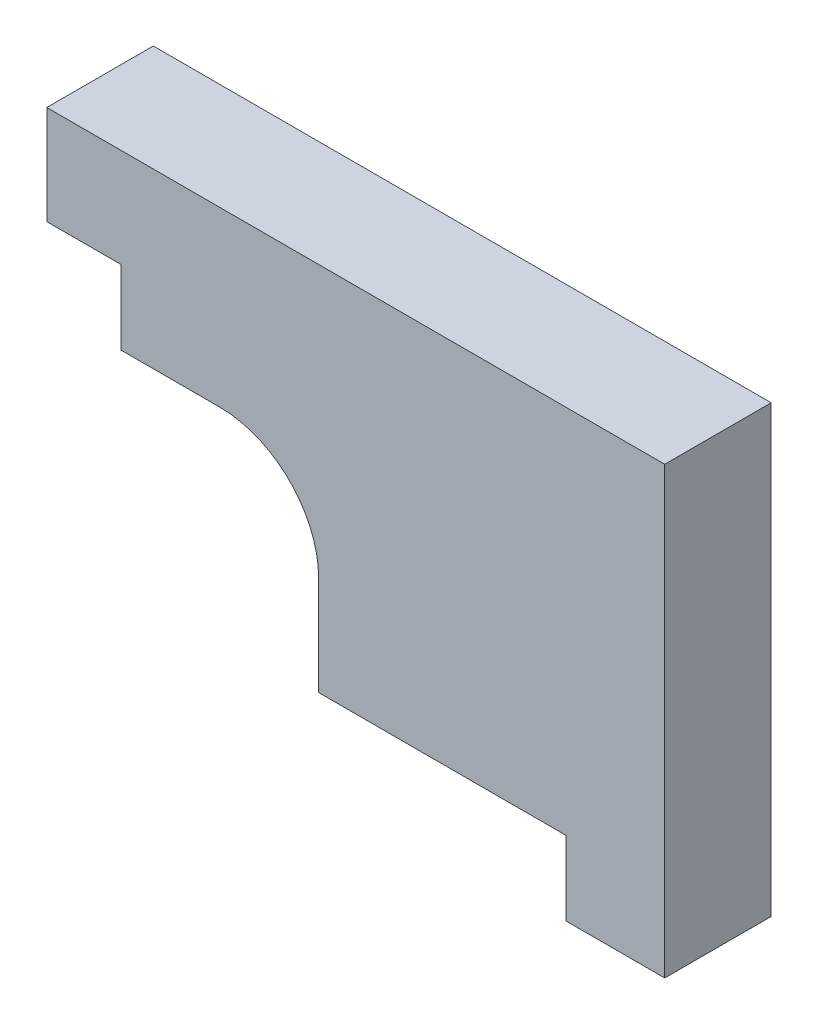
ISO-10303-21;
HEADER;
FILE_DESCRIPTION(('STEP AP214'),'2;1');
FILE_NAME('part.step','',(''),(''),'','','');
FILE_SCHEMA(('AUTOMOTIVE_DESIGN { 1 0 10303 214 1 1 1 1 }'));
ENDSEC;
DATA;
#1=APPLICATION_CONTEXT('core data for automotive mechanical design processes');
#2=APPLICATION_PROTOCOL_DEFINITION('international standard','automotive_design',2000,#1);
#3=PRODUCT_CONTEXT('',#1,'mechanical');
#4=PRODUCT('Part','Part','',(#3));
#5=PRODUCT_RELATED_PRODUCT_CATEGORY('part','',(#4));
#6=PRODUCT_DEFINITION_FORMATION('','',#4);
#7=PRODUCT_DEFINITION_CONTEXT('part definition',#1,'design');
#8=PRODUCT_DEFINITION('design','',#6,#7);
#9=PRODUCT_DEFINITION_SHAPE('','',#8);
#10=(LENGTH_UNIT() NAMED_UNIT(*) SI_UNIT(.MILLI.,.METRE.));
#11=(NAMED_UNIT(*) PLANE_ANGLE_UNIT() SI_UNIT($,.RADIAN.));
#12=(NAMED_UNIT(*) SI_UNIT($,.STERADIAN.) SOLID_ANGLE_UNIT());
#13=UNCERTAINTY_MEASURE_WITH_UNIT(LENGTH_MEASURE(1.E-05),#10,'distance_accuracy_value','');
#14=(GEOMETRIC_REPRESENTATION_CONTEXT(3) GLOBAL_UNCERTAINTY_ASSIGNED_CONTEXT((#13)) GLOBAL_UNIT_ASSIGNED_CONTEXT((#10,
#11,#12)) REPRESENTATION_CONTEXT('',''));
#15=CARTESIAN_POINT('',(0.,0.,0.));
#16=DIRECTION('',(0.,0.,1.));
#17=DIRECTION('',(1.,0.,0.));
#18=AXIS2_PLACEMENT_3D('',#15,#16,#17);
#19=CARTESIAN_POINT('',(130.,130.,-21.54283537726));
#20=DIRECTION('',(0.,0.,1.));
#21=DIRECTION('',(1.,0.,0.));
#22=AXIS2_PLACEMENT_3D('',#19,#20,#21);
#23=CYLINDRICAL_SURFACE('',#22,20.);
#24=CARTESIAN_POINT('',(130.,130.,0.));
#25=DIRECTION('',(0.,0.,-1.));
#26=DIRECTION('',(1.,0.,0.));
#27=AXIS2_PLACEMENT_3D('',#24,#25,#26);
#28=CIRCLE('',#27,20.);
#29=CARTESIAN_POINT('',(130.,150.,0.));
#30=VERTEX_POINT('',#29);
#31=CARTESIAN_POINT('',(150.,130.,0.));
#32=VERTEX_POINT('',#31);
#33=EDGE_CURVE('E154',#30,#32,#28,.T.);
#34=ORIENTED_EDGE('',*,*,#33,.F.);
#35=DIRECTION('',(0.,0.,1.));
#36=VECTOR('',#35,1.);
#37=CARTESIAN_POINT('',(130.,150.,-21.54283537726));
#38=LINE('',#37,#36);
#39=CARTESIAN_POINT('',(130.,150.,-21.54283537726));
#40=VERTEX_POINT('',#39);
#41=EDGE_CURVE('E11',#40,#30,#38,.T.);
#42=ORIENTED_EDGE('',*,*,#41,.F.);
#43=CARTESIAN_POINT('',(130.,130.,-21.54283537726));
#44=DIRECTION('',(0.,0.,-1.));
#45=DIRECTION('',(1.,0.,0.));
#46=AXIS2_PLACEMENT_3D('',#43,#44,#45);
#47=CIRCLE('',#46,20.);
#48=CARTESIAN_POINT('',(150.,130.,-21.54283537726));
#49=VERTEX_POINT('',#48);
#50=EDGE_CURVE('E183',#40,#49,#47,.T.);
#51=ORIENTED_EDGE('',*,*,#50,.T.);
#52=DIRECTION('',(0.,0.,1.));
#53=VECTOR('',#52,1.);
#54=CARTESIAN_POINT('',(150.,130.,-21.54283537726));
#55=LINE('',#54,#53);
#56=EDGE_CURVE('E42',#49,#32,#55,.T.);
#57=ORIENTED_EDGE('',*,*,#56,.T.);
#58=EDGE_LOOP('',(#34,#42,#51,#57));
#59=FACE_BOUND('',#58,.T.);
#60=ADVANCED_FACE('F39',(#59),#23,.F.);
#61=CARTESIAN_POINT('',(130.,150.,-21.54283537726));
#62=DIRECTION('',(0.,-1.,0.));
#63=DIRECTION('',(0.,0.,-1.));
#64=AXIS2_PLACEMENT_3D('',#61,#62,#63);
#65=PLANE('',#64);
#66=DIRECTION('',(1.,0.,0.));
#67=VECTOR('',#66,1.);
#68=CARTESIAN_POINT('',(130.,150.,0.));
#69=LINE('',#68,#67);
#70=CARTESIAN_POINT('',(110.,150.,0.));
#71=VERTEX_POINT('',#70);
#72=EDGE_CURVE('E181',#71,#30,#69,.T.);
#73=ORIENTED_EDGE('',*,*,#72,.F.);
#74=DIRECTION('',(0.,0.,1.));
#75=VECTOR('',#74,1.);
#76=CARTESIAN_POINT('',(110.,150.,-21.54283537726));
#77=LINE('',#76,#75);
#78=CARTESIAN_POINT('',(110.,150.,-21.54283537726));
#79=VERTEX_POINT('',#78);
#80=EDGE_CURVE('E48',#79,#71,#77,.T.);
#81=ORIENTED_EDGE('',*,*,#80,.F.);
#82=DIRECTION('',(1.,0.,0.));
#83=VECTOR('',#82,1.);
#84=CARTESIAN_POINT('',(130.,150.,-21.54283537726));
#85=LINE('',#84,#83);
#86=EDGE_CURVE('E144',#79,#40,#85,.T.);
#87=ORIENTED_EDGE('',*,*,#86,.T.);
#88=ORIENTED_EDGE('',*,*,#41,.T.);
#89=EDGE_LOOP('',(#73,#81,#87,#88));
#90=FACE_BOUND('',#89,.T.);
#91=ADVANCED_FACE('F201',(#90),#65,.T.);
#92=CARTESIAN_POINT('',(110.,150.,-21.54283537726));
#93=DIRECTION('',(-1.,0.,0.));
#94=DIRECTION('',(0.,0.,1.));
#95=AXIS2_PLACEMENT_3D('',#92,#93,#94);
#96=PLANE('',#95);
#97=DIRECTION('',(0.,-1.,0.));
#98=VECTOR('',#97,1.);
#99=CARTESIAN_POINT('',(110.,150.,0.));
#100=LINE('',#99,#98);
#101=CARTESIAN_POINT('',(110.,165.,0.));
#102=VERTEX_POINT('',#101);
#103=EDGE_CURVE('E131',#102,#71,#100,.T.);
#104=ORIENTED_EDGE('',*,*,#103,.F.);
#105=DIRECTION('',(0.,0.,1.));
#106=VECTOR('',#105,1.);
#107=CARTESIAN_POINT('',(110.,165.,-21.54283537726));
#108=LINE('',#107,#106);
#109=CARTESIAN_POINT('',(110.,165.,-21.54283537726));
#110=VERTEX_POINT('',#109);
#111=EDGE_CURVE('E126',#110,#102,#108,.T.);
#112=ORIENTED_EDGE('',*,*,#111,.F.);
#113=DIRECTION('',(0.,-1.,0.));
#114=VECTOR('',#113,1.);
#115=CARTESIAN_POINT('',(110.,150.,-21.54283537726));
#116=LINE('',#115,#114);
#117=EDGE_CURVE('E129',#110,#79,#116,.T.);
#118=ORIENTED_EDGE('',*,*,#117,.T.);
#119=ORIENTED_EDGE('',*,*,#80,.T.);
#120=EDGE_LOOP('',(#104,#112,#118,#119));
#121=FACE_BOUND('',#120,.T.);
#122=ADVANCED_FACE('F128',(#121),#96,.T.);
#123=CARTESIAN_POINT('',(110.,165.,-21.54283537726));
#124=DIRECTION('',(0.,-1.,0.));
#125=DIRECTION('',(1.,0.,0.));
#126=AXIS2_PLACEMENT_3D('',#123,#124,#125);
#127=PLANE('',#126);
#128=DIRECTION('',(1.,0.,0.));
#129=VECTOR('',#128,1.);
#130=CARTESIAN_POINT('',(110.,165.,0.));
#131=LINE('',#130,#129);
#132=CARTESIAN_POINT('',(95.0000000000001,165.,0.));
#133=VERTEX_POINT('',#132);
#134=EDGE_CURVE('E178',#133,#102,#131,.T.);
#135=ORIENTED_EDGE('',*,*,#134,.F.);
#136=DIRECTION('',(0.,0.,1.));
#137=VECTOR('',#136,1.);
#138=CARTESIAN_POINT('',(95.0000000000001,165.,-21.54283537726));
#139=LINE('',#138,#137);
#140=CARTESIAN_POINT('',(95.0000000000001,165.,-21.54283537726));
#141=VERTEX_POINT('',#140);
#142=EDGE_CURVE('E136',#141,#133,#139,.T.);
#143=ORIENTED_EDGE('',*,*,#142,.F.);
#144=DIRECTION('',(1.,0.,0.));
#145=VECTOR('',#144,1.);
#146=CARTESIAN_POINT('',(110.,165.,-21.54283537726));
#147=LINE('',#146,#145);
#148=EDGE_CURVE('E142',#141,#110,#147,.T.);
#149=ORIENTED_EDGE('',*,*,#148,.T.);
#150=ORIENTED_EDGE('',*,*,#111,.T.);
#151=EDGE_LOOP('',(#135,#143,#149,#150));
#152=FACE_BOUND('',#151,.T.);
#153=ADVANCED_FACE('F146',(#152),#127,.T.);
#154=CARTESIAN_POINT('',(95.0000000000001,165.,-21.54283537726));
#155=DIRECTION('',(-1.,0.,0.));
#156=DIRECTION('',(0.,-1.,0.));
#157=AXIS2_PLACEMENT_3D('',#154,#155,#156);
#158=PLANE('',#157);
#159=DIRECTION('',(0.,-1.,0.));
#160=VECTOR('',#159,1.);
#161=CARTESIAN_POINT('',(95.0000000000001,165.,0.));
#162=LINE('',#161,#160);
#163=CARTESIAN_POINT('',(95.0000000000002,185.,0.));
#164=VERTEX_POINT('',#163);
#165=EDGE_CURVE('E175',#164,#133,#162,.T.);
#166=ORIENTED_EDGE('',*,*,#165,.F.);
#167=DIRECTION('',(0.,0.,1.));
#168=VECTOR('',#167,1.);
#169=CARTESIAN_POINT('',(95.0000000000002,185.,-21.54283537726));
#170=LINE('',#169,#168);
#171=CARTESIAN_POINT('',(95.0000000000002,185.,-21.54283537726));
#172=VERTEX_POINT('',#171);
#173=EDGE_CURVE('E187',#172,#164,#170,.T.);
#174=ORIENTED_EDGE('',*,*,#173,.F.);
#175=DIRECTION('',(0.,-1.,0.));
#176=VECTOR('',#175,1.);
#177=CARTESIAN_POINT('',(95.0000000000001,165.,-21.54283537726));
#178=LINE('',#177,#176);
#179=EDGE_CURVE('E147',#172,#141,#178,.T.);
#180=ORIENTED_EDGE('',*,*,#179,.T.);
#181=ORIENTED_EDGE('',*,*,#142,.T.);
#182=EDGE_LOOP('',(#166,#174,#180,#181));
#183=FACE_BOUND('',#182,.T.);
#184=ADVANCED_FACE('F214',(#183),#158,.T.);
#185=CARTESIAN_POINT('',(95.0000000000002,185.,-21.54283537726));
#186=DIRECTION('',(0.,1.,0.));
#187=DIRECTION('',(-1.,0.,0.));
#188=AXIS2_PLACEMENT_3D('',#185,#186,#187);
#189=PLANE('',#188);
#190=DIRECTION('',(-1.,0.,0.));
#191=VECTOR('',#190,1.);
#192=CARTESIAN_POINT('',(95.0000000000002,185.,0.));
#193=LINE('',#192,#191);
#194=CARTESIAN_POINT('',(220.,185.,0.));
#195=VERTEX_POINT('',#194);
#196=EDGE_CURVE('E172',#195,#164,#193,.T.);
#197=ORIENTED_EDGE('',*,*,#196,.F.);
#198=DIRECTION('',(0.,0.,1.));
#199=VECTOR('',#198,1.);
#200=CARTESIAN_POINT('',(220.,185.,-21.54283537726));
#201=LINE('',#200,#199);
#202=CARTESIAN_POINT('',(220.,185.,-21.54283537726));
#203=VERTEX_POINT('',#202);
#204=EDGE_CURVE('E189',#203,#195,#201,.T.);
#205=ORIENTED_EDGE('',*,*,#204,.F.);
#206=DIRECTION('',(-1.,0.,0.));
#207=VECTOR('',#206,1.);
#208=CARTESIAN_POINT('',(95.0000000000002,185.,-21.54283537726));
#209=LINE('',#208,#207);
#210=EDGE_CURVE('E149',#203,#172,#209,.T.);
#211=ORIENTED_EDGE('',*,*,#210,.T.);
#212=ORIENTED_EDGE('',*,*,#173,.T.);
#213=EDGE_LOOP('',(#197,#205,#211,#212));
#214=FACE_BOUND('',#213,.T.);
#215=ADVANCED_FACE('F217',(#214),#189,.T.);
#216=CARTESIAN_POINT('',(220.,185.,-21.54283537726));
#217=DIRECTION('',(1.,0.,0.));
#218=DIRECTION('',(0.,1.,0.));
#219=AXIS2_PLACEMENT_3D('',#216,#217,#218);
#220=PLANE('',#219);
#221=DIRECTION('',(0.,1.,0.));
#222=VECTOR('',#221,1.);
#223=CARTESIAN_POINT('',(220.,185.,0.));
#224=LINE('',#223,#222);
#225=CARTESIAN_POINT('',(220.,95.0000000000001,0.));
#226=VERTEX_POINT('',#225);
#227=EDGE_CURVE('E169',#226,#195,#224,.T.);
#228=ORIENTED_EDGE('',*,*,#227,.F.);
#229=DIRECTION('',(0.,0.,1.));
#230=VECTOR('',#229,1.);
#231=CARTESIAN_POINT('',(220.,95.0000000000001,-21.54283537726));
#232=LINE('',#231,#230);
#233=CARTESIAN_POINT('',(220.,95.0000000000001,-21.54283537726));
#234=VERTEX_POINT('',#233);
#235=EDGE_CURVE('E191',#234,#226,#232,.T.);
#236=ORIENTED_EDGE('',*,*,#235,.F.);
#237=DIRECTION('',(0.,1.,0.));
#238=VECTOR('',#237,1.);
#239=CARTESIAN_POINT('',(220.,185.,-21.54283537726));
#240=LINE('',#239,#238);
#241=EDGE_CURVE('E339',#234,#203,#240,.T.);
#242=ORIENTED_EDGE('',*,*,#241,.T.);
#243=ORIENTED_EDGE('',*,*,#204,.T.);
#244=EDGE_LOOP('',(#228,#236,#242,#243));
#245=FACE_BOUND('',#244,.T.);
#246=ADVANCED_FACE('F221',(#245),#220,.T.);
#247=CARTESIAN_POINT('',(220.,95.0000000000001,-21.54283537726));
#248=DIRECTION('',(0.,-1.,0.));
#249=DIRECTION('',(1.,0.,0.));
#250=AXIS2_PLACEMENT_3D('',#247,#248,#249);
#251=PLANE('',#250);
#252=DIRECTION('',(1.,0.,0.));
#253=VECTOR('',#252,1.);
#254=CARTESIAN_POINT('',(220.,95.0000000000001,0.));
#255=LINE('',#254,#253);
#256=CARTESIAN_POINT('',(200.,95.,0.));
#257=VERTEX_POINT('',#256);
#258=EDGE_CURVE('E166',#257,#226,#255,.T.);
#259=ORIENTED_EDGE('',*,*,#258,.F.);
#260=DIRECTION('',(0.,0.,1.));
#261=VECTOR('',#260,1.);
#262=CARTESIAN_POINT('',(200.,95.,-21.54283537726));
#263=LINE('',#262,#261);
#264=CARTESIAN_POINT('',(200.,95.,-21.54283537726));
#265=VERTEX_POINT('',#264);
#266=EDGE_CURVE('E193',#265,#257,#263,.T.);
#267=ORIENTED_EDGE('',*,*,#266,.F.);
#268=DIRECTION('',(1.,0.,0.));
#269=VECTOR('',#268,1.);
#270=CARTESIAN_POINT('',(220.,95.0000000000001,-21.54283537726));
#271=LINE('',#270,#269);
#272=EDGE_CURVE('E332',#265,#234,#271,.T.);
#273=ORIENTED_EDGE('',*,*,#272,.T.);
#274=ORIENTED_EDGE('',*,*,#235,.T.);
#275=EDGE_LOOP('',(#259,#267,#273,#274));
#276=FACE_BOUND('',#275,.T.);
#277=ADVANCED_FACE('F225',(#276),#251,.T.);
#278=CARTESIAN_POINT('',(200.,95.,-21.54283537726));
#279=DIRECTION('',(-1.,0.,0.));
#280=DIRECTION('',(0.,0.,1.));
#281=AXIS2_PLACEMENT_3D('',#278,#279,#280);
#282=PLANE('',#281);
#283=DIRECTION('',(0.,-1.,0.));
#284=VECTOR('',#283,1.);
#285=CARTESIAN_POINT('',(200.,95.,0.));
#286=LINE('',#285,#284);
#287=CARTESIAN_POINT('',(200.,110.,0.));
#288=VERTEX_POINT('',#287);
#289=EDGE_CURVE('E163',#288,#257,#286,.T.);
#290=ORIENTED_EDGE('',*,*,#289,.F.);
#291=DIRECTION('',(0.,0.,1.));
#292=VECTOR('',#291,1.);
#293=CARTESIAN_POINT('',(200.,110.,-21.54283537726));
#294=LINE('',#293,#292);
#295=CARTESIAN_POINT('',(200.,110.,-21.54283537726));
#296=VERTEX_POINT('',#295);
#297=EDGE_CURVE('E195',#296,#288,#294,.T.);
#298=ORIENTED_EDGE('',*,*,#297,.F.);
#299=DIRECTION('',(0.,-1.,0.));
#300=VECTOR('',#299,1.);
#301=CARTESIAN_POINT('',(200.,95.,-21.54283537726));
#302=LINE('',#301,#300);
#303=EDGE_CURVE('E328',#296,#265,#302,.T.);
#304=ORIENTED_EDGE('',*,*,#303,.T.);
#305=ORIENTED_EDGE('',*,*,#266,.T.);
#306=EDGE_LOOP('',(#290,#298,#304,#305));
#307=FACE_BOUND('',#306,.T.);
#308=ADVANCED_FACE('F229',(#307),#282,.T.);
#309=CARTESIAN_POINT('',(200.,110.,-21.54283537726));
#310=DIRECTION('',(0.,-1.,0.));
#311=DIRECTION('',(1.,0.,0.));
#312=AXIS2_PLACEMENT_3D('',#309,#310,#311);
#313=PLANE('',#312);
#314=DIRECTION('',(1.,0.,0.));
#315=VECTOR('',#314,1.);
#316=CARTESIAN_POINT('',(200.,110.,0.));
#317=LINE('',#316,#315);
#318=CARTESIAN_POINT('',(150.,110.,0.));
#319=VERTEX_POINT('',#318);
#320=EDGE_CURVE('E160',#319,#288,#317,.T.);
#321=ORIENTED_EDGE('',*,*,#320,.F.);
#322=DIRECTION('',(0.,0.,1.));
#323=VECTOR('',#322,1.);
#324=CARTESIAN_POINT('',(150.,110.,-21.54283537726));
#325=LINE('',#324,#323);
#326=CARTESIAN_POINT('',(150.,110.,-21.54283537726));
#327=VERTEX_POINT('',#326);
#328=EDGE_CURVE('E196',#327,#319,#325,.T.);
#329=ORIENTED_EDGE('',*,*,#328,.F.);
#330=DIRECTION('',(1.,0.,0.));
#331=VECTOR('',#330,1.);
#332=CARTESIAN_POINT('',(200.,110.,-21.54283537726));
#333=LINE('',#332,#331);
#334=EDGE_CURVE('E344',#327,#296,#333,.T.);
#335=ORIENTED_EDGE('',*,*,#334,.T.);
#336=ORIENTED_EDGE('',*,*,#297,.T.);
#337=EDGE_LOOP('',(#321,#329,#335,#336));
#338=FACE_BOUND('',#337,.T.);
#339=ADVANCED_FACE('F233',(#338),#313,.T.);
#340=CARTESIAN_POINT('',(150.,110.,-21.54283537726));
#341=DIRECTION('',(-1.,0.,0.));
#342=DIRECTION('',(0.,-1.,0.));
#343=AXIS2_PLACEMENT_3D('',#340,#341,#342);
#344=PLANE('',#343);
#345=DIRECTION('',(0.,-1.,0.));
#346=VECTOR('',#345,1.);
#347=CARTESIAN_POINT('',(150.,110.,0.));
#348=LINE('',#347,#346);
#349=EDGE_CURVE('E157',#32,#319,#348,.T.);
#350=ORIENTED_EDGE('',*,*,#349,.F.);
#351=ORIENTED_EDGE('',*,*,#56,.F.);
#352=DIRECTION('',(0.,-1.,0.));
#353=VECTOR('',#352,1.);
#354=CARTESIAN_POINT('',(150.,110.,-21.54283537726));
#355=LINE('',#354,#353);
#356=EDGE_CURVE('E346',#49,#327,#355,.T.);
#357=ORIENTED_EDGE('',*,*,#356,.T.);
#358=ORIENTED_EDGE('',*,*,#328,.T.);
#359=EDGE_LOOP('',(#350,#351,#357,#358));
#360=FACE_BOUND('',#359,.T.);
#361=ADVANCED_FACE('F198',(#360),#344,.T.);
#362=CARTESIAN_POINT('',(130.,130.,-21.54283537726));
#363=DIRECTION('',(0.,0.,1.));
#364=DIRECTION('',(1.,0.,0.));
#365=AXIS2_PLACEMENT_3D('',#362,#363,#364);
#366=PLANE('',#365);
#367=ORIENTED_EDGE('',*,*,#50,.F.);
#368=ORIENTED_EDGE('',*,*,#86,.F.);
#369=ORIENTED_EDGE('',*,*,#117,.F.);
#370=ORIENTED_EDGE('',*,*,#148,.F.);
#371=ORIENTED_EDGE('',*,*,#179,.F.);
#372=ORIENTED_EDGE('',*,*,#210,.F.);
#373=ORIENTED_EDGE('',*,*,#241,.F.);
#374=ORIENTED_EDGE('',*,*,#272,.F.);
#375=ORIENTED_EDGE('',*,*,#303,.F.);
#376=ORIENTED_EDGE('',*,*,#334,.F.);
#377=ORIENTED_EDGE('',*,*,#356,.F.);
#378=EDGE_LOOP('',(#367,#368,#369,#370,#371,#372,#373,#374,#375,#376,#377));
#379=FACE_BOUND('',#378,.T.);
#380=ADVANCED_FACE('F140',(#379),#366,.F.);
#381=CARTESIAN_POINT('',(130.,130.,0.));
#382=DIRECTION('',(0.,0.,1.));
#383=DIRECTION('',(1.,0.,0.));
#384=AXIS2_PLACEMENT_3D('',#381,#382,#383);
#385=PLANE('',#384);
#386=ORIENTED_EDGE('',*,*,#33,.T.);
#387=ORIENTED_EDGE('',*,*,#349,.T.);
#388=ORIENTED_EDGE('',*,*,#320,.T.);
#389=ORIENTED_EDGE('',*,*,#289,.T.);
#390=ORIENTED_EDGE('',*,*,#258,.T.);
#391=ORIENTED_EDGE('',*,*,#227,.T.);
#392=ORIENTED_EDGE('',*,*,#196,.T.);
#393=ORIENTED_EDGE('',*,*,#165,.T.);
#394=ORIENTED_EDGE('',*,*,#134,.T.);
#395=ORIENTED_EDGE('',*,*,#103,.T.);
#396=ORIENTED_EDGE('',*,*,#72,.T.);
#397=EDGE_LOOP('',(#386,#387,#388,#389,#390,#391,#392,#393,#394,#395,#396));
#398=FACE_BOUND('',#397,.T.);
#399=ADVANCED_FACE('F200',(#398),#385,.T.);
#400=CLOSED_SHELL('',(#60,#91,#122,#153,#184,#215,#246,#277,#308,#339,#361,#380,#399));
#401=MANIFOLD_SOLID_BREP('B2',#400);
#402=ADVANCED_BREP_SHAPE_REPRESENTATION('',(#18,#401),#14);
#403=SHAPE_DEFINITION_REPRESENTATION(#9,#402);
ENDSEC;
END-ISO-10303-21;
